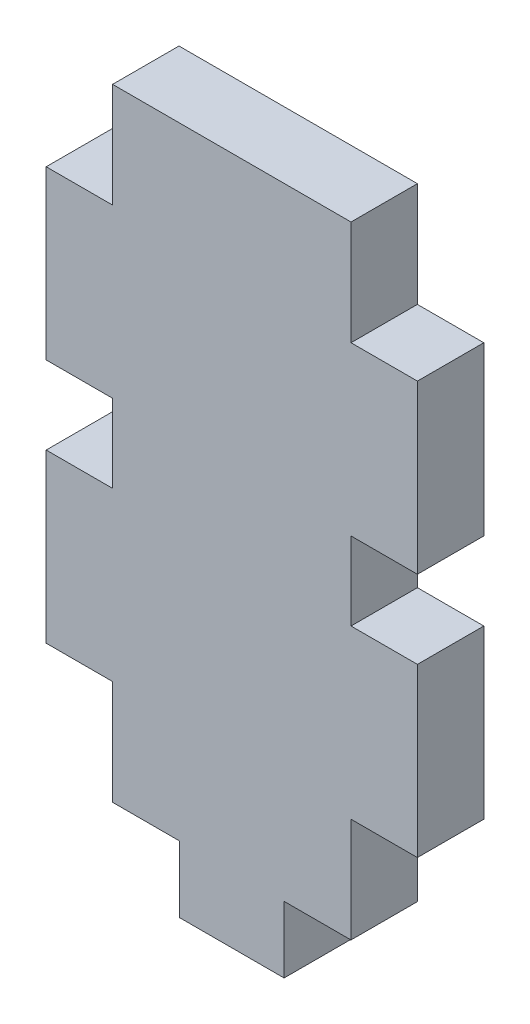
ISO-10303-21;
HEADER;
FILE_DESCRIPTION(('STEP AP214'),'2;1');
FILE_NAME('part.step','',(''),(''),'','','');
FILE_SCHEMA(('AUTOMOTIVE_DESIGN { 1 0 10303 214 1 1 1 1 }'));
ENDSEC;
DATA;
#1=APPLICATION_CONTEXT('core data for automotive mechanical design processes');
#2=APPLICATION_PROTOCOL_DEFINITION('international standard','automotive_design',2000,#1);
#3=PRODUCT_CONTEXT('',#1,'mechanical');
#4=PRODUCT('Part','Part','',(#3));
#5=PRODUCT_RELATED_PRODUCT_CATEGORY('part','',(#4));
#6=PRODUCT_DEFINITION_FORMATION('','',#4);
#7=PRODUCT_DEFINITION_CONTEXT('part definition',#1,'design');
#8=PRODUCT_DEFINITION('design','',#6,#7);
#9=PRODUCT_DEFINITION_SHAPE('','',#8);
#10=(LENGTH_UNIT() NAMED_UNIT(*) SI_UNIT(.MILLI.,.METRE.));
#11=(NAMED_UNIT(*) PLANE_ANGLE_UNIT() SI_UNIT($,.RADIAN.));
#12=(NAMED_UNIT(*) SI_UNIT($,.STERADIAN.) SOLID_ANGLE_UNIT());
#13=UNCERTAINTY_MEASURE_WITH_UNIT(LENGTH_MEASURE(1.E-05),#10,'distance_accuracy_value','');
#14=(GEOMETRIC_REPRESENTATION_CONTEXT(3) GLOBAL_UNCERTAINTY_ASSIGNED_CONTEXT((#13)) GLOBAL_UNIT_ASSIGNED_CONTEXT((#10,
#11,#12)) REPRESENTATION_CONTEXT('',''));
#15=CARTESIAN_POINT('',(0.,0.,0.));
#16=DIRECTION('',(0.,0.,1.));
#17=DIRECTION('',(1.,0.,0.));
#18=AXIS2_PLACEMENT_3D('',#15,#16,#17);
#19=CARTESIAN_POINT('',(-8.875,0.,3.175));
#20=DIRECTION('',(1.,0.,0.));
#21=DIRECTION('',(0.,0.,-1.));
#22=AXIS2_PLACEMENT_3D('',#19,#20,#21);
#23=PLANE('',#22);
#24=DIRECTION('',(0.,-1.,0.));
#25=VECTOR('',#24,1.);
#26=CARTESIAN_POINT('',(-8.875,0.,0.));
#27=LINE('',#26,#25);
#28=CARTESIAN_POINT('',(-8.875,9.865,0.));
#29=VERTEX_POINT('',#28);
#30=CARTESIAN_POINT('',(-8.875,1.865,0.));
#31=VERTEX_POINT('',#30);
#32=EDGE_CURVE('E341',#29,#31,#27,.T.);
#33=ORIENTED_EDGE('',*,*,#32,.T.);
#34=DIRECTION('',(0.,0.,-1.));
#35=VECTOR('',#34,1.);
#36=CARTESIAN_POINT('',(-8.875,1.865,3.175));
#37=LINE('',#36,#35);
#38=CARTESIAN_POINT('',(-8.875,1.865,3.175));
#39=VERTEX_POINT('',#38);
#40=EDGE_CURVE('E195',#39,#31,#37,.T.);
#41=ORIENTED_EDGE('',*,*,#40,.F.);
#42=DIRECTION('',(0.,-1.,0.));
#43=VECTOR('',#42,1.);
#44=CARTESIAN_POINT('',(-8.875,0.,3.175));
#45=LINE('',#44,#43);
#46=CARTESIAN_POINT('',(-8.875,9.865,3.175));
#47=VERTEX_POINT('',#46);
#48=EDGE_CURVE('E414',#47,#39,#45,.T.);
#49=ORIENTED_EDGE('',*,*,#48,.F.);
#50=DIRECTION('',(0.,0.,-1.));
#51=VECTOR('',#50,1.);
#52=CARTESIAN_POINT('',(-8.875,9.865,3.175));
#53=LINE('',#52,#51);
#54=EDGE_CURVE('E140',#47,#29,#53,.T.);
#55=ORIENTED_EDGE('',*,*,#54,.T.);
#56=EDGE_LOOP('',(#33,#41,#49,#55));
#57=FACE_BOUND('',#56,.T.);
#58=ADVANCED_FACE('F129',(#57),#23,.F.);
#59=CARTESIAN_POINT('',(0.,1.865,3.175));
#60=DIRECTION('',(0.,-1.,0.));
#61=DIRECTION('',(1.,0.,0.));
#62=AXIS2_PLACEMENT_3D('',#59,#60,#61);
#63=PLANE('',#62);
#64=DIRECTION('',(-1.,0.,0.));
#65=VECTOR('',#64,1.);
#66=CARTESIAN_POINT('',(0.,1.865,0.));
#67=LINE('',#66,#65);
#68=CARTESIAN_POINT('',(-5.7,1.865,0.));
#69=VERTEX_POINT('',#68);
#70=EDGE_CURVE('E337',#69,#31,#67,.T.);
#71=ORIENTED_EDGE('',*,*,#70,.F.);
#72=DIRECTION('',(0.,0.,-1.));
#73=VECTOR('',#72,1.);
#74=CARTESIAN_POINT('',(-5.7,1.865,3.175));
#75=LINE('',#74,#73);
#76=CARTESIAN_POINT('',(-5.7,1.865,3.175));
#77=VERTEX_POINT('',#76);
#78=EDGE_CURVE('E199',#77,#69,#75,.T.);
#79=ORIENTED_EDGE('',*,*,#78,.F.);
#80=DIRECTION('',(-1.,0.,0.));
#81=VECTOR('',#80,1.);
#82=CARTESIAN_POINT('',(0.,1.865,3.175));
#83=LINE('',#82,#81);
#84=EDGE_CURVE('E410',#77,#39,#83,.T.);
#85=ORIENTED_EDGE('',*,*,#84,.T.);
#86=ORIENTED_EDGE('',*,*,#40,.T.);
#87=EDGE_LOOP('',(#71,#79,#85,#86));
#88=FACE_BOUND('',#87,.T.);
#89=ADVANCED_FACE('F556',(#88),#63,.T.);
#90=CARTESIAN_POINT('',(-5.7,0.,3.175));
#91=DIRECTION('',(-1.,0.,0.));
#92=DIRECTION('',(0.,0.,1.));
#93=AXIS2_PLACEMENT_3D('',#90,#91,#92);
#94=PLANE('',#93);
#95=DIRECTION('',(0.,1.,0.));
#96=VECTOR('',#95,1.);
#97=CARTESIAN_POINT('',(-5.7,0.,0.));
#98=LINE('',#97,#96);
#99=CARTESIAN_POINT('',(-5.7,-1.865,0.));
#100=VERTEX_POINT('',#99);
#101=EDGE_CURVE('E333',#100,#69,#98,.T.);
#102=ORIENTED_EDGE('',*,*,#101,.F.);
#103=DIRECTION('',(0.,0.,-1.));
#104=VECTOR('',#103,1.);
#105=CARTESIAN_POINT('',(-5.7,-1.865,3.175));
#106=LINE('',#105,#104);
#107=CARTESIAN_POINT('',(-5.7,-1.865,3.175));
#108=VERTEX_POINT('',#107);
#109=EDGE_CURVE('E203',#108,#100,#106,.T.);
#110=ORIENTED_EDGE('',*,*,#109,.F.);
#111=DIRECTION('',(0.,1.,0.));
#112=VECTOR('',#111,1.);
#113=CARTESIAN_POINT('',(-5.7,0.,3.175));
#114=LINE('',#113,#112);
#115=EDGE_CURVE('E406',#108,#77,#114,.T.);
#116=ORIENTED_EDGE('',*,*,#115,.T.);
#117=ORIENTED_EDGE('',*,*,#78,.T.);
#118=EDGE_LOOP('',(#102,#110,#116,#117));
#119=FACE_BOUND('',#118,.T.);
#120=ADVANCED_FACE('F550',(#119),#94,.T.);
#121=CARTESIAN_POINT('',(0.,-1.865,3.175));
#122=DIRECTION('',(0.,-1.,0.));
#123=DIRECTION('',(1.,0.,0.));
#124=AXIS2_PLACEMENT_3D('',#121,#122,#123);
#125=PLANE('',#124);
#126=DIRECTION('',(-1.,0.,0.));
#127=VECTOR('',#126,1.);
#128=CARTESIAN_POINT('',(0.,-1.865,0.));
#129=LINE('',#128,#127);
#130=CARTESIAN_POINT('',(-8.875,-1.865,0.));
#131=VERTEX_POINT('',#130);
#132=EDGE_CURVE('E329',#100,#131,#129,.T.);
#133=ORIENTED_EDGE('',*,*,#132,.T.);
#134=DIRECTION('',(0.,0.,-1.));
#135=VECTOR('',#134,1.);
#136=CARTESIAN_POINT('',(-8.875,-1.865,3.175));
#137=LINE('',#136,#135);
#138=CARTESIAN_POINT('',(-8.875,-1.865,3.175));
#139=VERTEX_POINT('',#138);
#140=EDGE_CURVE('E207',#139,#131,#137,.T.);
#141=ORIENTED_EDGE('',*,*,#140,.F.);
#142=DIRECTION('',(-1.,0.,0.));
#143=VECTOR('',#142,1.);
#144=CARTESIAN_POINT('',(0.,-1.865,3.175));
#145=LINE('',#144,#143);
#146=EDGE_CURVE('E402',#108,#139,#145,.T.);
#147=ORIENTED_EDGE('',*,*,#146,.F.);
#148=ORIENTED_EDGE('',*,*,#109,.T.);
#149=EDGE_LOOP('',(#133,#141,#147,#148));
#150=FACE_BOUND('',#149,.T.);
#151=ADVANCED_FACE('F581',(#150),#125,.F.);
#152=CARTESIAN_POINT('',(-8.875,0.,3.175));
#153=DIRECTION('',(1.,0.,0.));
#154=DIRECTION('',(0.,1.,0.));
#155=AXIS2_PLACEMENT_3D('',#152,#153,#154);
#156=PLANE('',#155);
#157=DIRECTION('',(0.,-1.,0.));
#158=VECTOR('',#157,1.);
#159=CARTESIAN_POINT('',(-8.875,0.,0.));
#160=LINE('',#159,#158);
#161=CARTESIAN_POINT('',(-8.875,-9.865,0.));
#162=VERTEX_POINT('',#161);
#163=EDGE_CURVE('E325',#131,#162,#160,.T.);
#164=ORIENTED_EDGE('',*,*,#163,.T.);
#165=DIRECTION('',(0.,0.,-1.));
#166=VECTOR('',#165,1.);
#167=CARTESIAN_POINT('',(-8.875,-9.865,3.175));
#168=LINE('',#167,#166);
#169=CARTESIAN_POINT('',(-8.875,-9.865,3.175));
#170=VERTEX_POINT('',#169);
#171=EDGE_CURVE('E211',#170,#162,#168,.T.);
#172=ORIENTED_EDGE('',*,*,#171,.F.);
#173=DIRECTION('',(0.,-1.,0.));
#174=VECTOR('',#173,1.);
#175=CARTESIAN_POINT('',(-8.875,0.,3.175));
#176=LINE('',#175,#174);
#177=EDGE_CURVE('E398',#139,#170,#176,.T.);
#178=ORIENTED_EDGE('',*,*,#177,.F.);
#179=ORIENTED_EDGE('',*,*,#140,.T.);
#180=EDGE_LOOP('',(#164,#172,#178,#179));
#181=FACE_BOUND('',#180,.T.);
#182=ADVANCED_FACE('F544',(#181),#156,.F.);
#183=CARTESIAN_POINT('',(0.,-9.865,3.175));
#184=DIRECTION('',(0.,-1.,0.));
#185=DIRECTION('',(0.,0.,-1.));
#186=AXIS2_PLACEMENT_3D('',#183,#184,#185);
#187=PLANE('',#186);
#188=DIRECTION('',(-1.,0.,0.));
#189=VECTOR('',#188,1.);
#190=CARTESIAN_POINT('',(0.,-9.865,0.));
#191=LINE('',#190,#189);
#192=CARTESIAN_POINT('',(-5.7,-9.865,0.));
#193=VERTEX_POINT('',#192);
#194=EDGE_CURVE('E321',#193,#162,#191,.T.);
#195=ORIENTED_EDGE('',*,*,#194,.F.);
#196=DIRECTION('',(0.,0.,-1.));
#197=VECTOR('',#196,1.);
#198=CARTESIAN_POINT('',(-5.7,-9.865,3.175));
#199=LINE('',#198,#197);
#200=CARTESIAN_POINT('',(-5.7,-9.865,3.175));
#201=VERTEX_POINT('',#200);
#202=EDGE_CURVE('E215',#201,#193,#199,.T.);
#203=ORIENTED_EDGE('',*,*,#202,.F.);
#204=DIRECTION('',(-1.,0.,0.));
#205=VECTOR('',#204,1.);
#206=CARTESIAN_POINT('',(0.,-9.865,3.175));
#207=LINE('',#206,#205);
#208=EDGE_CURVE('E394',#201,#170,#207,.T.);
#209=ORIENTED_EDGE('',*,*,#208,.T.);
#210=ORIENTED_EDGE('',*,*,#171,.T.);
#211=EDGE_LOOP('',(#195,#203,#209,#210));
#212=FACE_BOUND('',#211,.T.);
#213=ADVANCED_FACE('F540',(#212),#187,.T.);
#214=CARTESIAN_POINT('',(-5.7,-14.865,0.));
#215=VERTEX_POINT('',#214);
#216=EDGE_CURVE('E320',#215,#193,#98,.T.);
#217=ORIENTED_EDGE('',*,*,#216,.F.);
#218=DIRECTION('',(0.,0.,-1.));
#219=VECTOR('',#218,1.);
#220=CARTESIAN_POINT('',(-5.7,-14.865,3.175));
#221=LINE('',#220,#219);
#222=CARTESIAN_POINT('',(-5.7,-14.865,3.175));
#223=VERTEX_POINT('',#222);
#224=EDGE_CURVE('E219',#223,#215,#221,.T.);
#225=ORIENTED_EDGE('',*,*,#224,.F.);
#226=EDGE_CURVE('E393',#223,#201,#114,.T.);
#227=ORIENTED_EDGE('',*,*,#226,.T.);
#228=ORIENTED_EDGE('',*,*,#202,.T.);
#229=EDGE_LOOP('',(#217,#225,#227,#228));
#230=FACE_BOUND('',#229,.T.);
#231=ADVANCED_FACE('F441',(#230),#94,.T.);
#232=CARTESIAN_POINT('',(0.,-14.865,3.175));
#233=DIRECTION('',(0.,1.,0.));
#234=DIRECTION('',(0.,0.,1.));
#235=AXIS2_PLACEMENT_3D('',#232,#233,#234);
#236=PLANE('',#235);
#237=DIRECTION('',(0.,0.,-1.));
#238=VECTOR('',#237,1.);
#239=CARTESIAN_POINT('',(-2.5,-14.865,3.175));
#240=LINE('',#239,#238);
#241=CARTESIAN_POINT('',(-2.5,-14.865,3.175));
#242=VERTEX_POINT('',#241);
#243=CARTESIAN_POINT('',(-2.5,-14.865,0.));
#244=VERTEX_POINT('',#243);
#245=EDGE_CURVE('E12',#242,#244,#240,.T.);
#246=ORIENTED_EDGE('',*,*,#245,.F.);
#247=DIRECTION('',(1.,0.,0.));
#248=VECTOR('',#247,1.);
#249=CARTESIAN_POINT('',(0.,-14.865,3.175));
#250=LINE('',#249,#248);
#251=EDGE_CURVE('E389',#223,#242,#250,.T.);
#252=ORIENTED_EDGE('',*,*,#251,.F.);
#253=ORIENTED_EDGE('',*,*,#224,.T.);
#254=DIRECTION('',(1.,0.,0.));
#255=VECTOR('',#254,1.);
#256=CARTESIAN_POINT('',(0.,-14.865,0.));
#257=LINE('',#256,#255);
#258=EDGE_CURVE('E180',#215,#244,#257,.T.);
#259=ORIENTED_EDGE('',*,*,#258,.T.);
#260=EDGE_LOOP('',(#246,#252,#253,#259));
#261=FACE_BOUND('',#260,.T.);
#262=ADVANCED_FACE('F591',(#261),#236,.F.);
#263=CARTESIAN_POINT('',(0.,-18.04,3.175));
#264=DIRECTION('',(0.,1.,0.));
#265=DIRECTION('',(-1.,0.,0.));
#266=AXIS2_PLACEMENT_3D('',#263,#264,#265);
#267=PLANE('',#266);
#268=DIRECTION('',(1.,0.,0.));
#269=VECTOR('',#268,1.);
#270=CARTESIAN_POINT('',(0.,-18.04,0.));
#271=LINE('',#270,#269);
#272=CARTESIAN_POINT('',(-2.5,-18.04,0.));
#273=VERTEX_POINT('',#272);
#274=CARTESIAN_POINT('',(2.5,-18.04,0.));
#275=VERTEX_POINT('',#274);
#276=EDGE_CURVE('E169',#273,#275,#271,.T.);
#277=ORIENTED_EDGE('',*,*,#276,.T.);
#278=DIRECTION('',(0.,0.,-1.));
#279=VECTOR('',#278,1.);
#280=CARTESIAN_POINT('',(2.5,-18.04,3.175));
#281=LINE('',#280,#279);
#282=CARTESIAN_POINT('',(2.5,-18.04,3.175));
#283=VERTEX_POINT('',#282);
#284=EDGE_CURVE('E223',#283,#275,#281,.T.);
#285=ORIENTED_EDGE('',*,*,#284,.F.);
#286=DIRECTION('',(1.,0.,0.));
#287=VECTOR('',#286,1.);
#288=CARTESIAN_POINT('',(0.,-18.04,3.175));
#289=LINE('',#288,#287);
#290=CARTESIAN_POINT('',(-2.5,-18.04,3.175));
#291=VERTEX_POINT('',#290);
#292=EDGE_CURVE('E159',#291,#283,#289,.T.);
#293=ORIENTED_EDGE('',*,*,#292,.F.);
#294=DIRECTION('',(0.,0.,-1.));
#295=VECTOR('',#294,1.);
#296=CARTESIAN_POINT('',(-2.5,-18.04,3.175));
#297=LINE('',#296,#295);
#298=EDGE_CURVE('E133',#291,#273,#297,.T.);
#299=ORIENTED_EDGE('',*,*,#298,.T.);
#300=EDGE_LOOP('',(#277,#285,#293,#299));
#301=FACE_BOUND('',#300,.T.);
#302=ADVANCED_FACE('F183',(#301),#267,.F.);
#303=CARTESIAN_POINT('',(2.5,0.,3.175));
#304=DIRECTION('',(1.,0.,0.));
#305=DIRECTION('',(0.,1.,0.));
#306=AXIS2_PLACEMENT_3D('',#303,#304,#305);
#307=PLANE('',#306);
#308=DIRECTION('',(0.,-1.,0.));
#309=VECTOR('',#308,1.);
#310=CARTESIAN_POINT('',(2.5,0.,0.));
#311=LINE('',#310,#309);
#312=CARTESIAN_POINT('',(2.5,-14.865,0.));
#313=VERTEX_POINT('',#312);
#314=EDGE_CURVE('E178',#313,#275,#311,.T.);
#315=ORIENTED_EDGE('',*,*,#314,.F.);
#316=DIRECTION('',(0.,0.,-1.));
#317=VECTOR('',#316,1.);
#318=CARTESIAN_POINT('',(2.5,-14.865,3.175));
#319=LINE('',#318,#317);
#320=CARTESIAN_POINT('',(2.5,-14.865,3.175));
#321=VERTEX_POINT('',#320);
#322=EDGE_CURVE('E227',#321,#313,#319,.T.);
#323=ORIENTED_EDGE('',*,*,#322,.F.);
#324=DIRECTION('',(0.,-1.,0.));
#325=VECTOR('',#324,1.);
#326=CARTESIAN_POINT('',(2.5,0.,3.175));
#327=LINE('',#326,#325);
#328=EDGE_CURVE('E383',#321,#283,#327,.T.);
#329=ORIENTED_EDGE('',*,*,#328,.T.);
#330=ORIENTED_EDGE('',*,*,#284,.T.);
#331=EDGE_LOOP('',(#315,#323,#329,#330));
#332=FACE_BOUND('',#331,.T.);
#333=ADVANCED_FACE('F590',(#332),#307,.T.);
#334=CARTESIAN_POINT('',(5.7,-14.865,0.));
#335=VERTEX_POINT('',#334);
#336=EDGE_CURVE('E315',#313,#335,#257,.T.);
#337=ORIENTED_EDGE('',*,*,#336,.T.);
#338=DIRECTION('',(0.,0.,-1.));
#339=VECTOR('',#338,1.);
#340=CARTESIAN_POINT('',(5.7,-14.865,3.175));
#341=LINE('',#340,#339);
#342=CARTESIAN_POINT('',(5.7,-14.865,3.175));
#343=VERTEX_POINT('',#342);
#344=EDGE_CURVE('E231',#343,#335,#341,.T.);
#345=ORIENTED_EDGE('',*,*,#344,.F.);
#346=EDGE_CURVE('E382',#321,#343,#250,.T.);
#347=ORIENTED_EDGE('',*,*,#346,.F.);
#348=ORIENTED_EDGE('',*,*,#322,.T.);
#349=EDGE_LOOP('',(#337,#345,#347,#348));
#350=FACE_BOUND('',#349,.T.);
#351=ADVANCED_FACE('F594',(#350),#236,.F.);
#352=CARTESIAN_POINT('',(5.7,0.,3.175));
#353=DIRECTION('',(-1.,0.,0.));
#354=DIRECTION('',(0.,0.,1.));
#355=AXIS2_PLACEMENT_3D('',#352,#353,#354);
#356=PLANE('',#355);
#357=DIRECTION('',(0.,1.,0.));
#358=VECTOR('',#357,1.);
#359=CARTESIAN_POINT('',(5.7,0.,0.));
#360=LINE('',#359,#358);
#361=CARTESIAN_POINT('',(5.7,-9.865,0.));
#362=VERTEX_POINT('',#361);
#363=EDGE_CURVE('E311',#335,#362,#360,.T.);
#364=ORIENTED_EDGE('',*,*,#363,.T.);
#365=DIRECTION('',(0.,0.,-1.));
#366=VECTOR('',#365,1.);
#367=CARTESIAN_POINT('',(5.7,-9.865,3.175));
#368=LINE('',#367,#366);
#369=CARTESIAN_POINT('',(5.7,-9.865,3.175));
#370=VERTEX_POINT('',#369);
#371=EDGE_CURVE('E235',#370,#362,#368,.T.);
#372=ORIENTED_EDGE('',*,*,#371,.F.);
#373=DIRECTION('',(0.,1.,0.));
#374=VECTOR('',#373,1.);
#375=CARTESIAN_POINT('',(5.7,0.,3.175));
#376=LINE('',#375,#374);
#377=EDGE_CURVE('E378',#343,#370,#376,.T.);
#378=ORIENTED_EDGE('',*,*,#377,.F.);
#379=ORIENTED_EDGE('',*,*,#344,.T.);
#380=EDGE_LOOP('',(#364,#372,#378,#379));
#381=FACE_BOUND('',#380,.T.);
#382=ADVANCED_FACE('F598',(#381),#356,.F.);
#383=CARTESIAN_POINT('',(0.,-9.865,3.175));
#384=DIRECTION('',(0.,1.,0.));
#385=DIRECTION('',(0.,0.,1.));
#386=AXIS2_PLACEMENT_3D('',#383,#384,#385);
#387=PLANE('',#386);
#388=DIRECTION('',(1.,0.,0.));
#389=VECTOR('',#388,1.);
#390=CARTESIAN_POINT('',(0.,-9.865,0.));
#391=LINE('',#390,#389);
#392=CARTESIAN_POINT('',(8.875,-9.865,0.));
#393=VERTEX_POINT('',#392);
#394=EDGE_CURVE('E307',#362,#393,#391,.T.);
#395=ORIENTED_EDGE('',*,*,#394,.T.);
#396=DIRECTION('',(0.,0.,-1.));
#397=VECTOR('',#396,1.);
#398=CARTESIAN_POINT('',(8.875,-9.865,3.175));
#399=LINE('',#398,#397);
#400=CARTESIAN_POINT('',(8.875,-9.865,3.175));
#401=VERTEX_POINT('',#400);
#402=EDGE_CURVE('E239',#401,#393,#399,.T.);
#403=ORIENTED_EDGE('',*,*,#402,.F.);
#404=DIRECTION('',(1.,0.,0.));
#405=VECTOR('',#404,1.);
#406=CARTESIAN_POINT('',(0.,-9.865,3.175));
#407=LINE('',#406,#405);
#408=EDGE_CURVE('E374',#370,#401,#407,.T.);
#409=ORIENTED_EDGE('',*,*,#408,.F.);
#410=ORIENTED_EDGE('',*,*,#371,.T.);
#411=EDGE_LOOP('',(#395,#403,#409,#410));
#412=FACE_BOUND('',#411,.T.);
#413=ADVANCED_FACE('F600',(#412),#387,.F.);
#414=CARTESIAN_POINT('',(8.875,0.,3.175));
#415=DIRECTION('',(1.,0.,0.));
#416=DIRECTION('',(0.,0.,-1.));
#417=AXIS2_PLACEMENT_3D('',#414,#415,#416);
#418=PLANE('',#417);
#419=DIRECTION('',(0.,-1.,0.));
#420=VECTOR('',#419,1.);
#421=CARTESIAN_POINT('',(8.875,0.,0.));
#422=LINE('',#421,#420);
#423=CARTESIAN_POINT('',(8.875,-1.865,0.));
#424=VERTEX_POINT('',#423);
#425=EDGE_CURVE('E303',#424,#393,#422,.T.);
#426=ORIENTED_EDGE('',*,*,#425,.F.);
#427=DIRECTION('',(0.,0.,-1.));
#428=VECTOR('',#427,1.);
#429=CARTESIAN_POINT('',(8.875,-1.865,3.175));
#430=LINE('',#429,#428);
#431=CARTESIAN_POINT('',(8.875,-1.865,3.175));
#432=VERTEX_POINT('',#431);
#433=EDGE_CURVE('E243',#432,#424,#430,.T.);
#434=ORIENTED_EDGE('',*,*,#433,.F.);
#435=DIRECTION('',(0.,-1.,0.));
#436=VECTOR('',#435,1.);
#437=CARTESIAN_POINT('',(8.875,0.,3.175));
#438=LINE('',#437,#436);
#439=EDGE_CURVE('E370',#432,#401,#438,.T.);
#440=ORIENTED_EDGE('',*,*,#439,.T.);
#441=ORIENTED_EDGE('',*,*,#402,.T.);
#442=EDGE_LOOP('',(#426,#434,#440,#441));
#443=FACE_BOUND('',#442,.T.);
#444=ADVANCED_FACE('F603',(#443),#418,.T.);
#445=CARTESIAN_POINT('',(0.,-1.865,3.175));
#446=DIRECTION('',(0.,1.,0.));
#447=DIRECTION('',(-1.,0.,0.));
#448=AXIS2_PLACEMENT_3D('',#445,#446,#447);
#449=PLANE('',#448);
#450=DIRECTION('',(1.,0.,0.));
#451=VECTOR('',#450,1.);
#452=CARTESIAN_POINT('',(0.,-1.865,0.));
#453=LINE('',#452,#451);
#454=CARTESIAN_POINT('',(5.7,-1.865,0.));
#455=VERTEX_POINT('',#454);
#456=EDGE_CURVE('E299',#455,#424,#453,.T.);
#457=ORIENTED_EDGE('',*,*,#456,.F.);
#458=DIRECTION('',(0.,0.,-1.));
#459=VECTOR('',#458,1.);
#460=CARTESIAN_POINT('',(5.7,-1.865,3.175));
#461=LINE('',#460,#459);
#462=CARTESIAN_POINT('',(5.7,-1.865,3.175));
#463=VERTEX_POINT('',#462);
#464=EDGE_CURVE('E247',#463,#455,#461,.T.);
#465=ORIENTED_EDGE('',*,*,#464,.F.);
#466=DIRECTION('',(1.,0.,0.));
#467=VECTOR('',#466,1.);
#468=CARTESIAN_POINT('',(0.,-1.865,3.175));
#469=LINE('',#468,#467);
#470=EDGE_CURVE('E366',#463,#432,#469,.T.);
#471=ORIENTED_EDGE('',*,*,#470,.T.);
#472=ORIENTED_EDGE('',*,*,#433,.T.);
#473=EDGE_LOOP('',(#457,#465,#471,#472));
#474=FACE_BOUND('',#473,.T.);
#475=ADVANCED_FACE('F607',(#474),#449,.T.);
#476=CARTESIAN_POINT('',(5.7,1.865,0.));
#477=VERTEX_POINT('',#476);
#478=EDGE_CURVE('E298',#455,#477,#360,.T.);
#479=ORIENTED_EDGE('',*,*,#478,.T.);
#480=DIRECTION('',(0.,0.,-1.));
#481=VECTOR('',#480,1.);
#482=CARTESIAN_POINT('',(5.7,1.865,3.175));
#483=LINE('',#482,#481);
#484=CARTESIAN_POINT('',(5.7,1.865,3.175));
#485=VERTEX_POINT('',#484);
#486=EDGE_CURVE('E251',#485,#477,#483,.T.);
#487=ORIENTED_EDGE('',*,*,#486,.F.);
#488=EDGE_CURVE('E365',#463,#485,#376,.T.);
#489=ORIENTED_EDGE('',*,*,#488,.F.);
#490=ORIENTED_EDGE('',*,*,#464,.T.);
#491=EDGE_LOOP('',(#479,#487,#489,#490));
#492=FACE_BOUND('',#491,.T.);
#493=ADVANCED_FACE('F611',(#492),#356,.F.);
#494=CARTESIAN_POINT('',(0.,1.865,3.175));
#495=DIRECTION('',(0.,1.,0.));
#496=DIRECTION('',(-1.,0.,0.));
#497=AXIS2_PLACEMENT_3D('',#494,#495,#496);
#498=PLANE('',#497);
#499=DIRECTION('',(1.,0.,0.));
#500=VECTOR('',#499,1.);
#501=CARTESIAN_POINT('',(0.,1.865,0.));
#502=LINE('',#501,#500);
#503=CARTESIAN_POINT('',(8.875,1.865,0.));
#504=VERTEX_POINT('',#503);
#505=EDGE_CURVE('E294',#477,#504,#502,.T.);
#506=ORIENTED_EDGE('',*,*,#505,.T.);
#507=DIRECTION('',(0.,0.,-1.));
#508=VECTOR('',#507,1.);
#509=CARTESIAN_POINT('',(8.875,1.865,3.175));
#510=LINE('',#509,#508);
#511=CARTESIAN_POINT('',(8.875,1.865,3.175));
#512=VERTEX_POINT('',#511);
#513=EDGE_CURVE('E255',#512,#504,#510,.T.);
#514=ORIENTED_EDGE('',*,*,#513,.F.);
#515=DIRECTION('',(1.,0.,0.));
#516=VECTOR('',#515,1.);
#517=CARTESIAN_POINT('',(0.,1.865,3.175));
#518=LINE('',#517,#516);
#519=EDGE_CURVE('E361',#485,#512,#518,.T.);
#520=ORIENTED_EDGE('',*,*,#519,.F.);
#521=ORIENTED_EDGE('',*,*,#486,.T.);
#522=EDGE_LOOP('',(#506,#514,#520,#521));
#523=FACE_BOUND('',#522,.T.);
#524=ADVANCED_FACE('F613',(#523),#498,.F.);
#525=CARTESIAN_POINT('',(8.875,0.,3.175));
#526=DIRECTION('',(1.,0.,0.));
#527=DIRECTION('',(0.,0.,-1.));
#528=AXIS2_PLACEMENT_3D('',#525,#526,#527);
#529=PLANE('',#528);
#530=DIRECTION('',(0.,-1.,0.));
#531=VECTOR('',#530,1.);
#532=CARTESIAN_POINT('',(8.875,0.,0.));
#533=LINE('',#532,#531);
#534=CARTESIAN_POINT('',(8.875,9.865,0.));
#535=VERTEX_POINT('',#534);
#536=EDGE_CURVE('E290',#535,#504,#533,.T.);
#537=ORIENTED_EDGE('',*,*,#536,.F.);
#538=DIRECTION('',(0.,0.,-1.));
#539=VECTOR('',#538,1.);
#540=CARTESIAN_POINT('',(8.875,9.865,3.175));
#541=LINE('',#540,#539);
#542=CARTESIAN_POINT('',(8.875,9.865,3.175));
#543=VERTEX_POINT('',#542);
#544=EDGE_CURVE('E259',#543,#535,#541,.T.);
#545=ORIENTED_EDGE('',*,*,#544,.F.);
#546=DIRECTION('',(0.,-1.,0.));
#547=VECTOR('',#546,1.);
#548=CARTESIAN_POINT('',(8.875,0.,3.175));
#549=LINE('',#548,#547);
#550=EDGE_CURVE('E357',#543,#512,#549,.T.);
#551=ORIENTED_EDGE('',*,*,#550,.T.);
#552=ORIENTED_EDGE('',*,*,#513,.T.);
#553=EDGE_LOOP('',(#537,#545,#551,#552));
#554=FACE_BOUND('',#553,.T.);
#555=ADVANCED_FACE('F616',(#554),#529,.T.);
#556=CARTESIAN_POINT('',(0.,9.865,3.175));
#557=DIRECTION('',(0.,1.,0.));
#558=DIRECTION('',(0.,0.,1.));
#559=AXIS2_PLACEMENT_3D('',#556,#557,#558);
#560=PLANE('',#559);
#561=DIRECTION('',(1.,0.,0.));
#562=VECTOR('',#561,1.);
#563=CARTESIAN_POINT('',(0.,9.865,0.));
#564=LINE('',#563,#562);
#565=CARTESIAN_POINT('',(5.7,9.865,0.));
#566=VERTEX_POINT('',#565);
#567=EDGE_CURVE('E286',#566,#535,#564,.T.);
#568=ORIENTED_EDGE('',*,*,#567,.F.);
#569=DIRECTION('',(0.,0.,-1.));
#570=VECTOR('',#569,1.);
#571=CARTESIAN_POINT('',(5.7,9.865,3.175));
#572=LINE('',#571,#570);
#573=CARTESIAN_POINT('',(5.7,9.865,3.175));
#574=VERTEX_POINT('',#573);
#575=EDGE_CURVE('E263',#574,#566,#572,.T.);
#576=ORIENTED_EDGE('',*,*,#575,.F.);
#577=DIRECTION('',(1.,0.,0.));
#578=VECTOR('',#577,1.);
#579=CARTESIAN_POINT('',(0.,9.865,3.175));
#580=LINE('',#579,#578);
#581=EDGE_CURVE('E353',#574,#543,#580,.T.);
#582=ORIENTED_EDGE('',*,*,#581,.T.);
#583=ORIENTED_EDGE('',*,*,#544,.T.);
#584=EDGE_LOOP('',(#568,#576,#582,#583));
#585=FACE_BOUND('',#584,.T.);
#586=ADVANCED_FACE('F620',(#585),#560,.T.);
#587=CARTESIAN_POINT('',(5.7,14.865,0.));
#588=VERTEX_POINT('',#587);
#589=EDGE_CURVE('E285',#566,#588,#360,.T.);
#590=ORIENTED_EDGE('',*,*,#589,.T.);
#591=DIRECTION('',(0.,0.,-1.));
#592=VECTOR('',#591,1.);
#593=CARTESIAN_POINT('',(5.7,14.865,3.175));
#594=LINE('',#593,#592);
#595=CARTESIAN_POINT('',(5.7,14.865,3.175));
#596=VERTEX_POINT('',#595);
#597=EDGE_CURVE('E267',#596,#588,#594,.T.);
#598=ORIENTED_EDGE('',*,*,#597,.F.);
#599=EDGE_CURVE('E352',#574,#596,#376,.T.);
#600=ORIENTED_EDGE('',*,*,#599,.F.);
#601=ORIENTED_EDGE('',*,*,#575,.T.);
#602=EDGE_LOOP('',(#590,#598,#600,#601));
#603=FACE_BOUND('',#602,.T.);
#604=ADVANCED_FACE('F624',(#603),#356,.F.);
#605=CARTESIAN_POINT('',(0.,14.865,3.175));
#606=DIRECTION('',(0.,1.,0.));
#607=DIRECTION('',(0.,0.,1.));
#608=AXIS2_PLACEMENT_3D('',#605,#606,#607);
#609=PLANE('',#608);
#610=DIRECTION('',(1.,0.,0.));
#611=VECTOR('',#610,1.);
#612=CARTESIAN_POINT('',(0.,14.865,0.));
#613=LINE('',#612,#611);
#614=CARTESIAN_POINT('',(-5.7,14.865,0.));
#615=VERTEX_POINT('',#614);
#616=EDGE_CURVE('E280',#615,#588,#613,.T.);
#617=ORIENTED_EDGE('',*,*,#616,.F.);
#618=DIRECTION('',(0.,0.,-1.));
#619=VECTOR('',#618,1.);
#620=CARTESIAN_POINT('',(-5.7,14.865,3.175));
#621=LINE('',#620,#619);
#622=CARTESIAN_POINT('',(-5.7,14.865,3.175));
#623=VERTEX_POINT('',#622);
#624=EDGE_CURVE('E271',#623,#615,#621,.T.);
#625=ORIENTED_EDGE('',*,*,#624,.F.);
#626=DIRECTION('',(1.,0.,0.));
#627=VECTOR('',#626,1.);
#628=CARTESIAN_POINT('',(0.,14.865,3.175));
#629=LINE('',#628,#627);
#630=EDGE_CURVE('E348',#623,#596,#629,.T.);
#631=ORIENTED_EDGE('',*,*,#630,.T.);
#632=ORIENTED_EDGE('',*,*,#597,.T.);
#633=EDGE_LOOP('',(#617,#625,#631,#632));
#634=FACE_BOUND('',#633,.T.);
#635=ADVANCED_FACE('F566',(#634),#609,.T.);
#636=CARTESIAN_POINT('',(-5.7,9.865,0.));
#637=VERTEX_POINT('',#636);
#638=EDGE_CURVE('E284',#637,#615,#98,.T.);
#639=ORIENTED_EDGE('',*,*,#638,.F.);
#640=DIRECTION('',(0.,0.,-1.));
#641=VECTOR('',#640,1.);
#642=CARTESIAN_POINT('',(-5.7,9.865,3.175));
#643=LINE('',#642,#641);
#644=CARTESIAN_POINT('',(-5.7,9.865,3.175));
#645=VERTEX_POINT('',#644);
#646=EDGE_CURVE('E275',#645,#637,#643,.T.);
#647=ORIENTED_EDGE('',*,*,#646,.F.);
#648=EDGE_CURVE('E279',#645,#623,#114,.T.);
#649=ORIENTED_EDGE('',*,*,#648,.T.);
#650=ORIENTED_EDGE('',*,*,#624,.T.);
#651=EDGE_LOOP('',(#639,#647,#649,#650));
#652=FACE_BOUND('',#651,.T.);
#653=ADVANCED_FACE('F559',(#652),#94,.T.);
#654=CARTESIAN_POINT('',(0.,9.865,3.175));
#655=DIRECTION('',(0.,-1.,0.));
#656=DIRECTION('',(0.,0.,-1.));
#657=AXIS2_PLACEMENT_3D('',#654,#655,#656);
#658=PLANE('',#657);
#659=DIRECTION('',(-1.,0.,0.));
#660=VECTOR('',#659,1.);
#661=CARTESIAN_POINT('',(0.,9.865,0.));
#662=LINE('',#661,#660);
#663=EDGE_CURVE('E186',#637,#29,#662,.T.);
#664=ORIENTED_EDGE('',*,*,#663,.T.);
#665=ORIENTED_EDGE('',*,*,#54,.F.);
#666=DIRECTION('',(-1.,0.,0.));
#667=VECTOR('',#666,1.);
#668=CARTESIAN_POINT('',(0.,9.865,3.175));
#669=LINE('',#668,#667);
#670=EDGE_CURVE('E418',#645,#47,#669,.T.);
#671=ORIENTED_EDGE('',*,*,#670,.F.);
#672=ORIENTED_EDGE('',*,*,#646,.T.);
#673=EDGE_LOOP('',(#664,#665,#671,#672));
#674=FACE_BOUND('',#673,.T.);
#675=ADVANCED_FACE('F557',(#674),#658,.F.);
#676=CARTESIAN_POINT('',(0.,0.,0.));
#677=DIRECTION('',(0.,0.,1.));
#678=DIRECTION('',(1.,0.,0.));
#679=AXIS2_PLACEMENT_3D('',#676,#677,#678);
#680=PLANE('',#679);
#681=ORIENTED_EDGE('',*,*,#663,.F.);
#682=ORIENTED_EDGE('',*,*,#638,.T.);
#683=ORIENTED_EDGE('',*,*,#616,.T.);
#684=ORIENTED_EDGE('',*,*,#589,.F.);
#685=ORIENTED_EDGE('',*,*,#567,.T.);
#686=ORIENTED_EDGE('',*,*,#536,.T.);
#687=ORIENTED_EDGE('',*,*,#505,.F.);
#688=ORIENTED_EDGE('',*,*,#478,.F.);
#689=ORIENTED_EDGE('',*,*,#456,.T.);
#690=ORIENTED_EDGE('',*,*,#425,.T.);
#691=ORIENTED_EDGE('',*,*,#394,.F.);
#692=ORIENTED_EDGE('',*,*,#363,.F.);
#693=ORIENTED_EDGE('',*,*,#336,.F.);
#694=ORIENTED_EDGE('',*,*,#314,.T.);
#695=ORIENTED_EDGE('',*,*,#276,.F.);
#696=DIRECTION('',(0.,-1.,0.));
#697=VECTOR('',#696,1.);
#698=CARTESIAN_POINT('',(-2.5,-14.865,0.));
#699=LINE('',#698,#697);
#700=EDGE_CURVE('E174',#244,#273,#699,.T.);
#701=ORIENTED_EDGE('',*,*,#700,.F.);
#702=ORIENTED_EDGE('',*,*,#258,.F.);
#703=ORIENTED_EDGE('',*,*,#216,.T.);
#704=ORIENTED_EDGE('',*,*,#194,.T.);
#705=ORIENTED_EDGE('',*,*,#163,.F.);
#706=ORIENTED_EDGE('',*,*,#132,.F.);
#707=ORIENTED_EDGE('',*,*,#101,.T.);
#708=ORIENTED_EDGE('',*,*,#70,.T.);
#709=ORIENTED_EDGE('',*,*,#32,.F.);
#710=EDGE_LOOP('',(#681,#682,#683,#684,#685,#686,#687,#688,#689,#690,#691,#692,#693,#694,#695,
#701,#702,#703,#704,#705,#706,#707,#708,#709));
#711=FACE_BOUND('',#710,.T.);
#712=ADVANCED_FACE('F171',(#711),#680,.F.);
#713=CARTESIAN_POINT('',(0.,0.,3.175));
#714=DIRECTION('',(0.,0.,1.));
#715=DIRECTION('',(1.,0.,0.));
#716=AXIS2_PLACEMENT_3D('',#713,#714,#715);
#717=PLANE('',#716);
#718=ORIENTED_EDGE('',*,*,#670,.T.);
#719=ORIENTED_EDGE('',*,*,#48,.T.);
#720=ORIENTED_EDGE('',*,*,#84,.F.);
#721=ORIENTED_EDGE('',*,*,#115,.F.);
#722=ORIENTED_EDGE('',*,*,#146,.T.);
#723=ORIENTED_EDGE('',*,*,#177,.T.);
#724=ORIENTED_EDGE('',*,*,#208,.F.);
#725=ORIENTED_EDGE('',*,*,#226,.F.);
#726=ORIENTED_EDGE('',*,*,#251,.T.);
#727=DIRECTION('',(0.,-1.,0.));
#728=VECTOR('',#727,1.);
#729=CARTESIAN_POINT('',(-2.5,-14.865,3.175));
#730=LINE('',#729,#728);
#731=EDGE_CURVE('E187',#242,#291,#730,.T.);
#732=ORIENTED_EDGE('',*,*,#731,.T.);
#733=ORIENTED_EDGE('',*,*,#292,.T.);
#734=ORIENTED_EDGE('',*,*,#328,.F.);
#735=ORIENTED_EDGE('',*,*,#346,.T.);
#736=ORIENTED_EDGE('',*,*,#377,.T.);
#737=ORIENTED_EDGE('',*,*,#408,.T.);
#738=ORIENTED_EDGE('',*,*,#439,.F.);
#739=ORIENTED_EDGE('',*,*,#470,.F.);
#740=ORIENTED_EDGE('',*,*,#488,.T.);
#741=ORIENTED_EDGE('',*,*,#519,.T.);
#742=ORIENTED_EDGE('',*,*,#550,.F.);
#743=ORIENTED_EDGE('',*,*,#581,.F.);
#744=ORIENTED_EDGE('',*,*,#599,.T.);
#745=ORIENTED_EDGE('',*,*,#630,.F.);
#746=ORIENTED_EDGE('',*,*,#648,.F.);
#747=EDGE_LOOP('',(#718,#719,#720,#721,#722,#723,#724,#725,#726,#732,#733,#734,#735,#736,#737,
#738,#739,#740,#741,#742,#743,#744,#745,#746));
#748=FACE_BOUND('',#747,.T.);
#749=ADVANCED_FACE('F564',(#748),#717,.T.);
#750=CARTESIAN_POINT('',(-2.5,-14.865,3.175));
#751=DIRECTION('',(1.,0.,0.));
#752=DIRECTION('',(0.,1.,0.));
#753=AXIS2_PLACEMENT_3D('',#750,#751,#752);
#754=PLANE('',#753);
#755=ORIENTED_EDGE('',*,*,#700,.T.);
#756=ORIENTED_EDGE('',*,*,#298,.F.);
#757=ORIENTED_EDGE('',*,*,#731,.F.);
#758=ORIENTED_EDGE('',*,*,#245,.T.);
#759=EDGE_LOOP('',(#755,#756,#757,#758));
#760=FACE_BOUND('',#759,.T.);
#761=ADVANCED_FACE('F131',(#760),#754,.F.);
#762=CLOSED_SHELL('',(#58,#89,#120,#151,#182,#213,#231,#262,#302,#333,#351,#382,#413,#444,#475,
#493,#524,#555,#586,#604,#635,#653,#675,#712,#749,#761));
#763=MANIFOLD_SOLID_BREP('B2',#762);
#764=ADVANCED_BREP_SHAPE_REPRESENTATION('',(#18,#763),#14);
#765=SHAPE_DEFINITION_REPRESENTATION(#9,#764);
ENDSEC;
END-ISO-10303-21;
